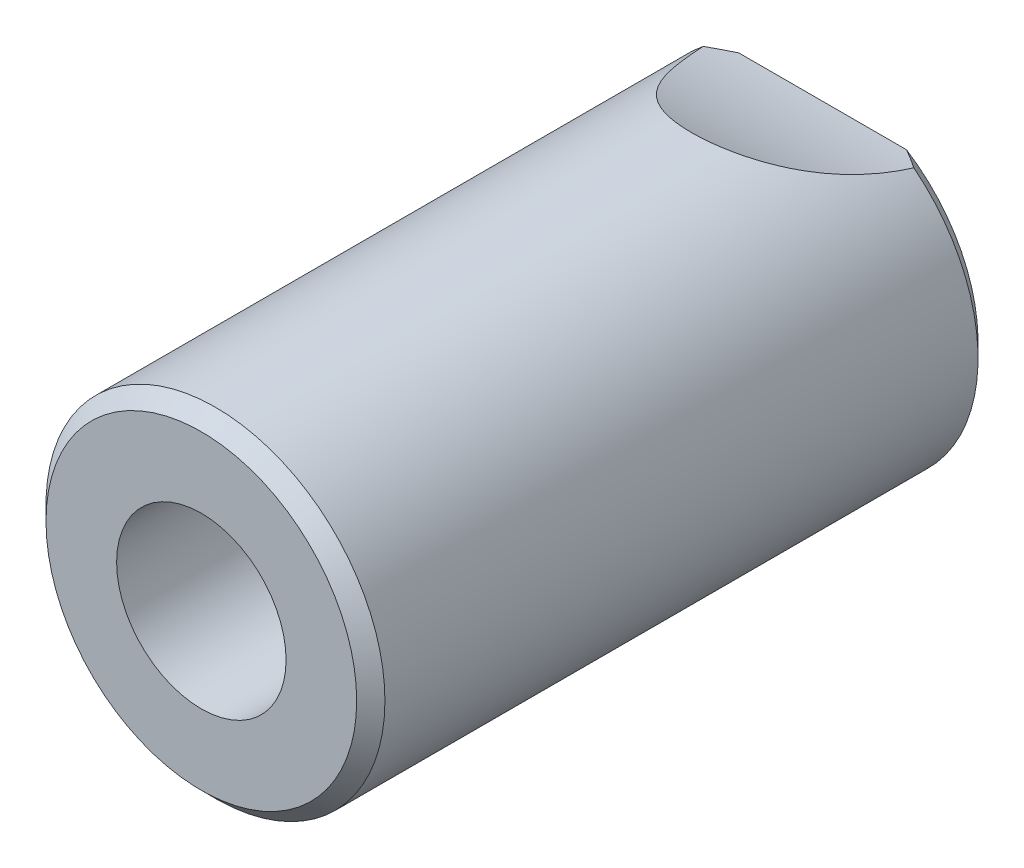
ISO-10303-21;
HEADER;
FILE_DESCRIPTION(('STEP AP214'),'2;1');
FILE_NAME('part.step','',(''),(''),'','','');
FILE_SCHEMA(('AUTOMOTIVE_DESIGN { 1 0 10303 214 1 1 1 1 }'));
ENDSEC;
DATA;
#1=APPLICATION_CONTEXT('core data for automotive mechanical design processes');
#2=APPLICATION_PROTOCOL_DEFINITION('international standard','automotive_design',2000,#1);
#3=PRODUCT_CONTEXT('',#1,'mechanical');
#4=PRODUCT('Part','Part','',(#3));
#5=PRODUCT_RELATED_PRODUCT_CATEGORY('part','',(#4));
#6=PRODUCT_DEFINITION_FORMATION('','',#4);
#7=PRODUCT_DEFINITION_CONTEXT('part definition',#1,'design');
#8=PRODUCT_DEFINITION('design','',#6,#7);
#9=PRODUCT_DEFINITION_SHAPE('','',#8);
#10=(LENGTH_UNIT() NAMED_UNIT(*) SI_UNIT(.MILLI.,.METRE.));
#11=(NAMED_UNIT(*) PLANE_ANGLE_UNIT() SI_UNIT($,.RADIAN.));
#12=(NAMED_UNIT(*) SI_UNIT($,.STERADIAN.) SOLID_ANGLE_UNIT());
#13=UNCERTAINTY_MEASURE_WITH_UNIT(LENGTH_MEASURE(1.E-05),#10,'distance_accuracy_value','');
#14=(GEOMETRIC_REPRESENTATION_CONTEXT(3) GLOBAL_UNCERTAINTY_ASSIGNED_CONTEXT((#13)) GLOBAL_UNIT_ASSIGNED_CONTEXT((#10,
#11,#12)) REPRESENTATION_CONTEXT('',''));
#15=CARTESIAN_POINT('',(0.,0.,0.));
#16=DIRECTION('',(0.,0.,1.));
#17=DIRECTION('',(1.,0.,0.));
#18=AXIS2_PLACEMENT_3D('',#15,#16,#17);
#19=CARTESIAN_POINT('',(0.,0.,44.));
#20=DIRECTION('',(0.,0.,-1.));
#21=DIRECTION('',(-1.,0.,0.));
#22=AXIS2_PLACEMENT_3D('',#19,#20,#21);
#23=CYLINDRICAL_SURFACE('',#22,12.);
#24=CARTESIAN_POINT('',(0.,0.,43.));
#25=DIRECTION('',(0.,0.,1.));
#26=DIRECTION('',(1.,0.,0.));
#27=AXIS2_PLACEMENT_3D('',#24,#25,#26);
#28=CIRCLE('',#27,12.);
#29=CARTESIAN_POINT('',(12.,0.,43.));
#30=VERTEX_POINT('',#29);
#31=EDGE_CURVE('E99',#30,#30,#28,.F.);
#32=ORIENTED_EDGE('',*,*,#31,.T.);
#33=EDGE_LOOP('',(#32));
#34=FACE_BOUND('',#33,.T.);
#35=CARTESIAN_POINT('',(-7.4518029043002,9.40588291844329,1.));
#36=CARTESIAN_POINT('',(-7.41363709608213,9.43611403899407,1.1849867303016));
#37=CARTESIAN_POINT('',(-7.37299296831536,9.46794281252737,1.36918999674879));
#38=CARTESIAN_POINT('',(-7.28647118322736,9.53469149949879,1.73582594776458));
#39=CARTESIAN_POINT('',(-7.24059277708178,9.56961185506315,1.91825837493297));
#40=CARTESIAN_POINT('',(-7.0944993708085,9.6789965774608,2.46329331068835));
#41=CARTESIAN_POINT('',(-6.98598764598837,9.75795391484746,2.82283735155454));
#42=CARTESIAN_POINT('',(-6.742694096215,9.92765763297107,3.53594295231416));
#43=CARTESIAN_POINT('',(-6.60756923037613,10.0185521523511,3.88935267593788));
#44=CARTESIAN_POINT('',(-6.30898081743042,10.209219224643,4.58124798353774));
#45=CARTESIAN_POINT('',(-6.14554708092314,10.3089823851886,4.91974880165069));
#46=CARTESIAN_POINT('',(-5.85386790370109,10.4761110934634,5.45445202855378));
#47=CARTESIAN_POINT('',(-5.73531165105133,10.5416441369742,5.65653971679134));
#48=CARTESIAN_POINT('',(-5.48475241962398,10.6741556889341,6.05177857492967));
#49=CARTESIAN_POINT('',(-5.3527486742839,10.7411342796137,6.2449292344693));
#50=CARTESIAN_POINT('',(-5.07497052028898,10.8751251761694,6.61984588491737));
#51=CARTESIAN_POINT('',(-4.92925226649756,10.9421363151666,6.80165363262986));
#52=CARTESIAN_POINT('',(-4.62294822096436,11.0750266684652,7.1526309493126));
#53=CARTESIAN_POINT('',(-4.46236647104456,11.1409061847446,7.32180393156974));
#54=CARTESIAN_POINT('',(-4.0339608095507,11.305074882009,7.73342695399222));
#55=CARTESIAN_POINT('',(-3.75532982702385,11.4014925477324,7.96565769894749));
#56=CARTESIAN_POINT('',(-3.16130202081899,11.5802437738469,8.3842418232182));
#57=CARTESIAN_POINT('',(-2.84593538923696,11.6625887647785,8.5706324907279));
#58=CARTESIAN_POINT('',(-2.24051765387714,11.7922955626858,8.85869527344772));
#59=CARTESIAN_POINT('',(-1.95564095977843,11.8432536956257,8.96947257087899));
#60=CARTESIAN_POINT('',(-1.51628482769121,11.9047423513635,9.10186283580249));
#61=CARTESIAN_POINT('',(-1.36778599225113,11.9227498667078,9.14036922750972));
#62=CARTESIAN_POINT('',(-1.0676926597656,11.95335626005,9.20557043124708));
#63=CARTESIAN_POINT('',(-0.916099427059828,11.9659573025067,9.23226997023287));
#64=CARTESIAN_POINT('',(-0.610267703095484,11.9854560975274,9.2735018568618));
#65=CARTESIAN_POINT('',(-0.456020905394035,11.9923302167985,9.28798378918423));
#66=CARTESIAN_POINT('',(-0.146705351884461,12.0001002782302,9.30434890561413));
#67=CARTESIAN_POINT('',(0.00836340530621088,12.0009962103322,9.30623206852357));
#68=CARTESIAN_POINT('',(0.318052982856972,11.9967839441216,9.29736491329713));
#69=CARTESIAN_POINT('',(0.472673809364008,11.9916758285974,9.28661476935914));
#70=CARTESIAN_POINT('',(0.78022653397428,11.9755985414597,9.25267042232298));
#71=CARTESIAN_POINT('',(0.933158473290197,11.9646295131898,9.22947652356852));
#72=CARTESIAN_POINT('',(1.22701709644606,11.9379587587937,9.17280371466513));
#73=CARTESIAN_POINT('',(1.36811052531868,11.9225833272156,9.14003154770797));
#74=CARTESIAN_POINT('',(1.6469762620392,11.887272860604,9.06431424389727));
#75=CARTESIAN_POINT('',(1.78474748706675,11.8673363605856,9.02136583834486));
#76=CARTESIAN_POINT('',(2.19189818903204,11.8013139561456,8.87809119871839));
#77=CARTESIAN_POINT('',(2.45529049432521,11.7489983954855,8.76330073194412));
#78=CARTESIAN_POINT('',(3.05080408703775,11.6110398272059,8.45409697240033));
#79=CARTESIAN_POINT('',(3.37447959678578,11.5201477561348,8.24587947372909));
#80=CARTESIAN_POINT('',(3.9808536362664,11.3249627589702,7.78157580988159));
#81=CARTESIAN_POINT('',(4.26348686929659,11.220648966039,7.52541481860858));
#82=CARTESIAN_POINT('',(4.71253338611542,11.0377821777098,7.0559534973077));
#83=CARTESIAN_POINT('',(4.88897893649464,10.9604595838803,6.85154810316986));
#84=CARTESIAN_POINT('',(5.22252502708832,10.8055112791828,6.42749911293807));
#85=CARTESIAN_POINT('',(5.37961674992708,10.7278854466565,6.20784864208737));
#86=CARTESIAN_POINT('',(5.67617785677468,10.5739784628877,5.75533799155587));
#87=CARTESIAN_POINT('',(5.81557957434947,10.4977033816775,5.52243174991316));
#88=CARTESIAN_POINT('',(6.07752475344193,10.3482571249719,5.046348814067));
#89=CARTESIAN_POINT('',(6.20006422380562,10.2750866871447,4.80316970610211));
#90=CARTESIAN_POINT('',(6.44555581375012,10.1231644544142,4.27409005203264));
#91=CARTESIAN_POINT('',(6.56620701967519,10.0450464937129,3.98694281534566));
#92=CARTESIAN_POINT('',(6.78929977869644,9.89562646812303,3.4038737900498));
#93=CARTESIAN_POINT('',(6.89173495102843,9.82432679559062,3.10794896898857));
#94=CARTESIAN_POINT('',(7.07885490161157,9.69035027719958,2.51283385960533));
#95=CARTESIAN_POINT('',(7.16374295080215,9.62757795975613,2.21372881091424));
#96=CARTESIAN_POINT('',(7.27991508433204,9.53966331541946,1.7612065596818));
#97=CARTESIAN_POINT('',(7.3167654782271,9.51141005027509,1.60978866541626));
#98=CARTESIAN_POINT('',(7.38691189200773,9.45703405548628,1.30575919661542));
#99=CARTESIAN_POINT('',(7.42020808532248,9.43091122190095,1.15314768071392));
#100=CARTESIAN_POINT('',(7.4518029043002,9.40588291844329,1.));
#101=B_SPLINE_CURVE_WITH_KNOTS('',3,(#35,#36,#37,#38,#39,#40,#41,#42,#43,#44,#45,#46,#47,#48,
#49,#50,#51,#52,#53,#54,#55,#56,#57,#58,#59,#60,#61,#62,#63,#64,#65,#66,#67,#68,#69,#70,#71,#72,
#73,#74,#75,#76,#77,#78,#79,#80,#81,#82,#83,#84,#85,#86,#87,#88,#89,#90,#91,#92,#93,#94,#95,#96,
#97,#98,#99,#100),.UNSPECIFIED.,.F.,.F.,(4,2,2,2,2,2,2,2,2,2,2,2,2,2,2,2,2,2,2,2,2,2,2,2,2,2,2,
2,2,2,2,2,4),(0.,0.573810352613885,1.14770289864584,2.29795129579371,3.46413137434579,
4.62909079339985,5.35850056348846,6.08795193623038,6.81453669453485,7.54092445029514,
8.66258277347306,9.78332565345053,10.708644751749,11.1715436698936,11.6342570950779,
12.0988706718443,12.5634850303448,13.0280929824551,13.4926895719126,13.9291921029317,
14.3658350329968,15.2385869517499,16.4185701239971,17.6004105065199,18.4419735711933,
19.2839186352933,20.1289929317188,20.9742669074265,21.9367998087164,22.8996692074868,
23.8506675847753,24.3257519993932,24.800813221397),.UNSPECIFIED.);
#102=CARTESIAN_POINT('',(-7.4518029043002,9.40588291844329,1.));
#103=VERTEX_POINT('',#102);
#104=CARTESIAN_POINT('',(7.4518029043002,9.40588291844329,1.));
#105=VERTEX_POINT('',#104);
#106=EDGE_CURVE('E69',#103,#105,#101,.T.);
#107=ORIENTED_EDGE('',*,*,#106,.F.);
#108=CARTESIAN_POINT('',(0.,0.,1.));
#109=DIRECTION('',(0.,0.,1.));
#110=DIRECTION('',(1.,0.,0.));
#111=AXIS2_PLACEMENT_3D('',#108,#109,#110);
#112=CIRCLE('',#111,12.);
#113=EDGE_CURVE('E93',#103,#105,#112,.T.);
#114=ORIENTED_EDGE('',*,*,#113,.T.);
#115=EDGE_LOOP('',(#107,#114));
#116=FACE_BOUND('',#115,.T.);
#117=ADVANCED_FACE('F47',(#34,#116),#23,.T.);
#118=CARTESIAN_POINT('',(0.,0.,0.));
#119=DIRECTION('',(0.,0.,1.));
#120=DIRECTION('',(1.,0.,0.));
#121=AXIS2_PLACEMENT_3D('',#118,#119,#120);
#122=PLANE('',#121);
#123=CARTESIAN_POINT('',(0.,0.,0.));
#124=DIRECTION('',(0.,0.,1.));
#125=DIRECTION('',(1.,0.,0.));
#126=AXIS2_PLACEMENT_3D('',#123,#124,#125);
#127=CIRCLE('',#126,6.);
#128=CARTESIAN_POINT('',(6.,0.,0.));
#129=VERTEX_POINT('',#128);
#130=EDGE_CURVE('E123',#129,#129,#127,.T.);
#131=ORIENTED_EDGE('',*,*,#130,.T.);
#132=EDGE_LOOP('',(#131));
#133=FACE_BOUND('',#132,.T.);
#134=DIRECTION('',(-1.,0.,0.));
#135=VECTOR('',#134,1.);
#136=CARTESIAN_POINT('',(84.462219947249,9.2591477021212,0.));
#137=LINE('',#136,#135);
#138=CARTESIAN_POINT('',(5.93870220084352,9.2591477021212,0.));
#139=VERTEX_POINT('',#138);
#140=CARTESIAN_POINT('',(-5.93870220084352,9.2591477021212,0.));
#141=VERTEX_POINT('',#140);
#142=EDGE_CURVE('E78',#139,#141,#137,.T.);
#143=ORIENTED_EDGE('',*,*,#142,.F.);
#144=CARTESIAN_POINT('',(0.,0.,0.));
#145=DIRECTION('',(0.,0.,1.));
#146=DIRECTION('',(1.,0.,0.));
#147=AXIS2_PLACEMENT_3D('',#144,#145,#146);
#148=CIRCLE('',#147,11.);
#149=EDGE_CURVE('E88',#139,#141,#148,.F.);
#150=ORIENTED_EDGE('',*,*,#149,.T.);
#151=EDGE_LOOP('',(#143,#150));
#152=FACE_BOUND('',#151,.T.);
#153=ADVANCED_FACE('F87',(#133,#152),#122,.F.);
#154=CARTESIAN_POINT('',(0.,0.,1.));
#155=DIRECTION('',(0.,0.,1.));
#156=DIRECTION('',(1.,0.,0.));
#157=AXIS2_PLACEMENT_3D('',#154,#155,#156);
#158=CONICAL_SURFACE('',#157,12.,0.785398163397448);
#159=ORIENTED_EDGE('',*,*,#113,.F.);
#160=CARTESIAN_POINT('',(-7.59162078874572,9.42242717349855,1.1002));
#161=CARTESIAN_POINT('',(-7.44437942102547,9.4047184935187,0.99404076374263));
#162=CARTESIAN_POINT('',(-7.29611295646199,9.38779505912013,0.889160666251786));
#163=CARTESIAN_POINT('',(-6.99747894154568,9.35548539405022,0.682375803601668));
#164=CARTESIAN_POINT('',(-6.84711260717348,9.34009831262374,0.580469414129506));
#165=CARTESIAN_POINT('',(-6.54405411576739,9.31080745651902,0.37992327000576));
#166=CARTESIAN_POINT('',(-6.39136180349254,9.29690378134671,0.281283734798304));
#167=CARTESIAN_POINT('',(-6.08343343697357,9.27052621152547,0.0876673559103371));
#168=CARTESIAN_POINT('',(-5.92819601218652,9.25805311821804,-0.00730741537720808));
#169=CARTESIAN_POINT('',(-5.77165714613586,9.24627567334323,-0.100200000000001));
#170=B_SPLINE_CURVE_WITH_KNOTS('',3,(#160,#161,#162,#163,#164,#165,#166,#167,#168,#169),
.UNSPECIFIED.,.F.,.F.,(4,2,2,2,4),(0.,0.547148381700038,1.09399207989928,1.64087243698708,
2.18805764865783),.UNSPECIFIED.);
#171=EDGE_CURVE('E11',#103,#141,#170,.T.);
#172=ORIENTED_EDGE('',*,*,#171,.T.);
#173=ORIENTED_EDGE('',*,*,#149,.F.);
#174=CARTESIAN_POINT('',(5.77165714613586,9.24627567334323,-0.1002));
#175=CARTESIAN_POINT('',(5.92819601218651,9.25805311821804,-0.00730741537720754));
#176=CARTESIAN_POINT('',(6.08343343697357,9.27052621152547,0.0876673559103374));
#177=CARTESIAN_POINT('',(6.39136180349254,9.29690378134671,0.281283734798304));
#178=CARTESIAN_POINT('',(6.54405411576739,9.31080745651902,0.37992327000576));
#179=CARTESIAN_POINT('',(6.84711260717348,9.34009831262374,0.580469414129506));
#180=CARTESIAN_POINT('',(6.99747894154568,9.35548539405022,0.682375803601668));
#181=CARTESIAN_POINT('',(7.29611295646199,9.38779505912013,0.889160666251786));
#182=CARTESIAN_POINT('',(7.44437942102547,9.4047184935187,0.99404076374263));
#183=CARTESIAN_POINT('',(7.59162078874573,9.42242717349854,1.1002));
#184=B_SPLINE_CURVE_WITH_KNOTS('',3,(#174,#175,#176,#177,#178,#179,#180,#181,#182,#183),
.UNSPECIFIED.,.F.,.F.,(4,2,2,2,4),(0.,0.547185211670756,1.09406556875856,1.6409092669578,
2.18805764865784),.UNSPECIFIED.);
#185=EDGE_CURVE('E62',#139,#105,#184,.T.);
#186=ORIENTED_EDGE('',*,*,#185,.T.);
#187=EDGE_LOOP('',(#159,#172,#173,#186));
#188=FACE_BOUND('',#187,.T.);
#189=ADVANCED_FACE('F91',(#188),#158,.T.);
#190=CARTESIAN_POINT('',(0.,0.,44.));
#191=DIRECTION('',(0.,0.,1.));
#192=DIRECTION('',(1.,0.,0.));
#193=AXIS2_PLACEMENT_3D('',#190,#191,#192);
#194=PLANE('',#193);
#195=CARTESIAN_POINT('',(0.,0.,44.));
#196=DIRECTION('',(0.,0.,1.));
#197=DIRECTION('',(1.,0.,0.));
#198=AXIS2_PLACEMENT_3D('',#195,#196,#197);
#199=CIRCLE('',#198,11.);
#200=CARTESIAN_POINT('',(11.,0.,44.));
#201=VERTEX_POINT('',#200);
#202=EDGE_CURVE('E84',#201,#201,#199,.T.);
#203=ORIENTED_EDGE('',*,*,#202,.T.);
#204=EDGE_LOOP('',(#203));
#205=FACE_BOUND('',#204,.T.);
#206=CARTESIAN_POINT('',(0.,0.,44.));
#207=DIRECTION('',(0.,0.,1.));
#208=DIRECTION('',(1.,0.,0.));
#209=AXIS2_PLACEMENT_3D('',#206,#207,#208);
#210=CIRCLE('',#209,6.);
#211=CARTESIAN_POINT('',(6.,0.,44.));
#212=VERTEX_POINT('',#211);
#213=EDGE_CURVE('E144',#212,#212,#210,.T.);
#214=ORIENTED_EDGE('',*,*,#213,.F.);
#215=EDGE_LOOP('',(#214));
#216=FACE_BOUND('',#215,.T.);
#217=ADVANCED_FACE('F131',(#205,#216),#194,.T.);
#218=CARTESIAN_POINT('',(0.,0.,0.));
#219=DIRECTION('',(0.,0.,1.));
#220=DIRECTION('',(1.,0.,0.));
#221=AXIS2_PLACEMENT_3D('',#218,#219,#220);
#222=CYLINDRICAL_SURFACE('',#221,6.);
#223=ORIENTED_EDGE('',*,*,#213,.T.);
#224=EDGE_LOOP('',(#223));
#225=FACE_BOUND('',#224,.T.);
#226=ORIENTED_EDGE('',*,*,#130,.F.);
#227=EDGE_LOOP('',(#226));
#228=FACE_BOUND('',#227,.T.);
#229=ADVANCED_FACE('F112',(#225,#228),#222,.F.);
#230=CARTESIAN_POINT('',(0.,0.,44.));
#231=DIRECTION('',(0.,0.,-1.));
#232=DIRECTION('',(-1.,0.,0.));
#233=AXIS2_PLACEMENT_3D('',#230,#231,#232);
#234=CONICAL_SURFACE('',#233,11.,0.785398163397447);
#235=ORIENTED_EDGE('',*,*,#31,.F.);
#236=EDGE_LOOP('',(#235));
#237=FACE_BOUND('',#236,.T.);
#238=ORIENTED_EDGE('',*,*,#202,.F.);
#239=EDGE_LOOP('',(#238));
#240=FACE_BOUND('',#239,.T.);
#241=ADVANCED_FACE('F50',(#237,#240),#234,.T.);
#242=CARTESIAN_POINT('',(84.462219947249,40.,-4.));
#243=DIRECTION('',(-1.,0.,0.));
#244=DIRECTION('',(0.,0.,1.));
#245=AXIS2_PLACEMENT_3D('',#242,#243,#244);
#246=CYLINDRICAL_SURFACE('',#245,31.);
#247=ORIENTED_EDGE('',*,*,#171,.F.);
#248=ORIENTED_EDGE('',*,*,#106,.T.);
#249=ORIENTED_EDGE('',*,*,#185,.F.);
#250=ORIENTED_EDGE('',*,*,#142,.T.);
#251=EDGE_LOOP('',(#247,#248,#249,#250));
#252=FACE_BOUND('',#251,.T.);
#253=ADVANCED_FACE('F77',(#252),#246,.F.);
#254=CLOSED_SHELL('',(#117,#153,#189,#217,#229,#241,#253));
#255=MANIFOLD_SOLID_BREP('B2',#254);
#256=ADVANCED_BREP_SHAPE_REPRESENTATION('',(#18,#255),#14);
#257=SHAPE_DEFINITION_REPRESENTATION(#9,#256);
ENDSEC;
END-ISO-10303-21;
